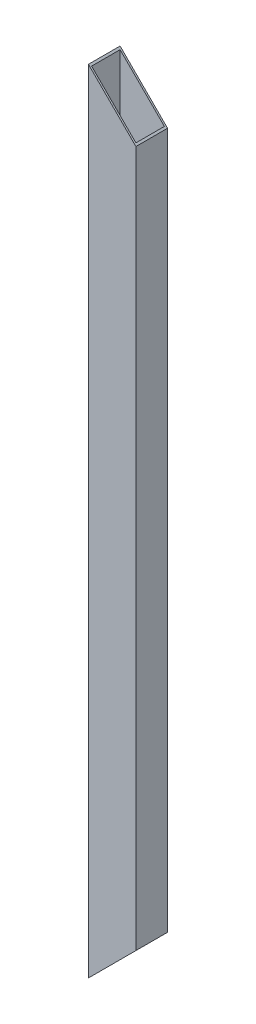
ISO-10303-21;
HEADER;
FILE_DESCRIPTION(('STEP AP214'),'2;1');
FILE_NAME('part.step','',(''),(''),'','','');
FILE_SCHEMA(('AUTOMOTIVE_DESIGN { 1 0 10303 214 1 1 1 1 }'));
ENDSEC;
DATA;
#1=APPLICATION_CONTEXT('core data for automotive mechanical design processes');
#2=APPLICATION_PROTOCOL_DEFINITION('international standard','automotive_design',2000,#1);
#3=PRODUCT_CONTEXT('',#1,'mechanical');
#4=PRODUCT('Part','Part','',(#3));
#5=PRODUCT_RELATED_PRODUCT_CATEGORY('part','',(#4));
#6=PRODUCT_DEFINITION_FORMATION('','',#4);
#7=PRODUCT_DEFINITION_CONTEXT('part definition',#1,'design');
#8=PRODUCT_DEFINITION('design','',#6,#7);
#9=PRODUCT_DEFINITION_SHAPE('','',#8);
#10=(LENGTH_UNIT() NAMED_UNIT(*) SI_UNIT(.MILLI.,.METRE.));
#11=(NAMED_UNIT(*) PLANE_ANGLE_UNIT() SI_UNIT($,.RADIAN.));
#12=(NAMED_UNIT(*) SI_UNIT($,.STERADIAN.) SOLID_ANGLE_UNIT());
#13=UNCERTAINTY_MEASURE_WITH_UNIT(LENGTH_MEASURE(1.E-05),#10,'distance_accuracy_value','');
#14=(GEOMETRIC_REPRESENTATION_CONTEXT(3) GLOBAL_UNCERTAINTY_ASSIGNED_CONTEXT((#13)) GLOBAL_UNIT_ASSIGNED_CONTEXT((#10,
#11,#12)) REPRESENTATION_CONTEXT('',''));
#15=CARTESIAN_POINT('',(0.,0.,0.));
#16=DIRECTION('',(0.,0.,1.));
#17=DIRECTION('',(1.,0.,0.));
#18=AXIS2_PLACEMENT_3D('',#15,#16,#17);
#19=CARTESIAN_POINT('',(2.,1000.,-38.));
#20=DIRECTION('',(0.,0.,1.));
#21=DIRECTION('',(1.,0.,0.));
#22=AXIS2_PLACEMENT_3D('',#19,#20,#21);
#23=PLANE('',#22);
#24=DIRECTION('',(0.,-1.,0.));
#25=VECTOR('',#24,1.);
#26=CARTESIAN_POINT('',(58.,1000.,-38.));
#27=LINE('',#26,#25);
#28=CARTESIAN_POINT('',(58.,942.,-38.));
#29=VERTEX_POINT('',#28);
#30=CARTESIAN_POINT('',(58.,58.0000000000007,-38.));
#31=VERTEX_POINT('',#30);
#32=EDGE_CURVE('E150',#29,#31,#27,.T.);
#33=ORIENTED_EDGE('',*,*,#32,.F.);
#34=DIRECTION('',(-0.707106781186546,0.707106781186549,0.));
#35=VECTOR('',#34,1.);
#36=CARTESIAN_POINT('',(1.,999.,-38.));
#37=LINE('',#36,#35);
#38=CARTESIAN_POINT('',(2.,998.,-38.));
#39=VERTEX_POINT('',#38);
#40=EDGE_CURVE('E11',#29,#39,#37,.T.);
#41=ORIENTED_EDGE('',*,*,#40,.T.);
#42=DIRECTION('',(0.,-1.,0.));
#43=VECTOR('',#42,1.);
#44=CARTESIAN_POINT('',(2.,1000.,-38.));
#45=LINE('',#44,#43);
#46=CARTESIAN_POINT('',(1.99999999999995,2.00000000000011,-38.));
#47=VERTEX_POINT('',#46);
#48=EDGE_CURVE('E145',#39,#47,#45,.T.);
#49=ORIENTED_EDGE('',*,*,#48,.T.);
#50=DIRECTION('',(-0.707106781186544,-0.707106781186551,0.));
#51=VECTOR('',#50,1.);
#52=CARTESIAN_POINT('',(501.,501.000000000005,-38.));
#53=LINE('',#52,#51);
#54=EDGE_CURVE('E41',#31,#47,#53,.T.);
#55=ORIENTED_EDGE('',*,*,#54,.F.);
#56=EDGE_LOOP('',(#33,#41,#49,#55));
#57=FACE_BOUND('',#56,.T.);
#58=ADVANCED_FACE('F33',(#57),#23,.T.);
#59=CARTESIAN_POINT('',(58.,1000.,-38.));
#60=DIRECTION('',(-1.,0.,0.));
#61=DIRECTION('',(0.,0.,1.));
#62=AXIS2_PLACEMENT_3D('',#59,#60,#61);
#63=PLANE('',#62);
#64=DIRECTION('',(0.,-1.,0.));
#65=VECTOR('',#64,1.);
#66=CARTESIAN_POINT('',(58.,1000.,-2.));
#67=LINE('',#66,#65);
#68=CARTESIAN_POINT('',(58.,942.,-2.));
#69=VERTEX_POINT('',#68);
#70=CARTESIAN_POINT('',(58.,58.0000000000007,-2.));
#71=VERTEX_POINT('',#70);
#72=EDGE_CURVE('E153',#69,#71,#67,.T.);
#73=ORIENTED_EDGE('',*,*,#72,.F.);
#74=DIRECTION('',(0.,0.,-1.));
#75=VECTOR('',#74,1.);
#76=CARTESIAN_POINT('',(58.,942.,-38.));
#77=LINE('',#76,#75);
#78=EDGE_CURVE('E166',#69,#29,#77,.T.);
#79=ORIENTED_EDGE('',*,*,#78,.T.);
#80=ORIENTED_EDGE('',*,*,#32,.T.);
#81=DIRECTION('',(0.,0.,-1.));
#82=VECTOR('',#81,1.);
#83=CARTESIAN_POINT('',(58.,58.0000000000007,-37.9999999999998));
#84=LINE('',#83,#82);
#85=EDGE_CURVE('E136',#71,#31,#84,.T.);
#86=ORIENTED_EDGE('',*,*,#85,.F.);
#87=EDGE_LOOP('',(#73,#79,#80,#86));
#88=FACE_BOUND('',#87,.T.);
#89=ADVANCED_FACE('F165',(#88),#63,.T.);
#90=CARTESIAN_POINT('',(2.,1000.,-2.));
#91=DIRECTION('',(0.,0.,-1.));
#92=DIRECTION('',(-1.,0.,0.));
#93=AXIS2_PLACEMENT_3D('',#90,#91,#92);
#94=PLANE('',#93);
#95=DIRECTION('',(0.,-1.,0.));
#96=VECTOR('',#95,1.);
#97=CARTESIAN_POINT('',(2.,1000.,-2.));
#98=LINE('',#97,#96);
#99=CARTESIAN_POINT('',(2.,998.,-2.));
#100=VERTEX_POINT('',#99);
#101=CARTESIAN_POINT('',(2.,2.00000000000006,-2.));
#102=VERTEX_POINT('',#101);
#103=EDGE_CURVE('E119',#100,#102,#98,.T.);
#104=ORIENTED_EDGE('',*,*,#103,.F.);
#105=DIRECTION('',(0.707106781186546,-0.707106781186549,0.));
#106=VECTOR('',#105,1.);
#107=CARTESIAN_POINT('',(1.00000000000001,999.,-2.));
#108=LINE('',#107,#106);
#109=EDGE_CURVE('E162',#100,#69,#108,.T.);
#110=ORIENTED_EDGE('',*,*,#109,.T.);
#111=ORIENTED_EDGE('',*,*,#72,.T.);
#112=DIRECTION('',(0.707106781186544,0.707106781186551,0.));
#113=VECTOR('',#112,1.);
#114=CARTESIAN_POINT('',(501.,501.000000000005,-2.));
#115=LINE('',#114,#113);
#116=EDGE_CURVE('E148',#102,#71,#115,.T.);
#117=ORIENTED_EDGE('',*,*,#116,.F.);
#118=EDGE_LOOP('',(#104,#110,#111,#117));
#119=FACE_BOUND('',#118,.T.);
#120=ADVANCED_FACE('F161',(#119),#94,.T.);
#121=CARTESIAN_POINT('',(2.,1000.,-38.));
#122=DIRECTION('',(1.,0.,0.));
#123=DIRECTION('',(0.,0.,-1.));
#124=AXIS2_PLACEMENT_3D('',#121,#122,#123);
#125=PLANE('',#124);
#126=ORIENTED_EDGE('',*,*,#48,.F.);
#127=DIRECTION('',(0.,0.,1.));
#128=VECTOR('',#127,1.);
#129=CARTESIAN_POINT('',(2.,998.,-38.));
#130=LINE('',#129,#128);
#131=EDGE_CURVE('E56',#39,#100,#130,.T.);
#132=ORIENTED_EDGE('',*,*,#131,.T.);
#133=ORIENTED_EDGE('',*,*,#103,.T.);
#134=DIRECTION('',(0.,0.,1.));
#135=VECTOR('',#134,1.);
#136=CARTESIAN_POINT('',(2.,2.00000000000011,-37.9999999999999));
#137=LINE('',#136,#135);
#138=EDGE_CURVE('E133',#47,#102,#137,.T.);
#139=ORIENTED_EDGE('',*,*,#138,.F.);
#140=EDGE_LOOP('',(#126,#132,#133,#139));
#141=FACE_BOUND('',#140,.T.);
#142=ADVANCED_FACE('F144',(#141),#125,.T.);
#143=CARTESIAN_POINT('',(0.,0.,660.));
#144=DIRECTION('',(-0.707106781186551,0.707106781186544,0.));
#145=DIRECTION('',(-0.707106781186544,-0.707106781186551,0.));
#146=AXIS2_PLACEMENT_3D('',#143,#144,#145);
#147=PLANE('',#146);
#148=ORIENTED_EDGE('',*,*,#138,.T.);
#149=ORIENTED_EDGE('',*,*,#116,.T.);
#150=ORIENTED_EDGE('',*,*,#85,.T.);
#151=ORIENTED_EDGE('',*,*,#54,.T.);
#152=EDGE_LOOP('',(#148,#149,#150,#151));
#153=FACE_BOUND('',#152,.T.);
#154=DIRECTION('',(0.,0.,1.));
#155=VECTOR('',#154,1.);
#156=CARTESIAN_POINT('',(0.,0.,0.));
#157=LINE('',#156,#155);
#158=CARTESIAN_POINT('',(0.,0.,-40.));
#159=VERTEX_POINT('',#158);
#160=CARTESIAN_POINT('',(0.,0.,0.));
#161=VERTEX_POINT('',#160);
#162=EDGE_CURVE('E117',#159,#161,#157,.T.);
#163=ORIENTED_EDGE('',*,*,#162,.F.);
#164=DIRECTION('',(0.707106781186544,0.707106781186551,0.));
#165=VECTOR('',#164,1.);
#166=CARTESIAN_POINT('',(0.,0.,-40.));
#167=LINE('',#166,#165);
#168=CARTESIAN_POINT('',(60.,60.0000000000006,-40.));
#169=VERTEX_POINT('',#168);
#170=EDGE_CURVE('E109',#159,#169,#167,.T.);
#171=ORIENTED_EDGE('',*,*,#170,.T.);
#172=DIRECTION('',(0.,0.,-1.));
#173=VECTOR('',#172,1.);
#174=CARTESIAN_POINT('',(60.,60.0000000000006,660.));
#175=LINE('',#174,#173);
#176=CARTESIAN_POINT('',(60.,60.0000000000006,0.));
#177=VERTEX_POINT('',#176);
#178=EDGE_CURVE('E103',#177,#169,#175,.T.);
#179=ORIENTED_EDGE('',*,*,#178,.F.);
#180=DIRECTION('',(0.707106781186544,0.707106781186551,0.));
#181=VECTOR('',#180,1.);
#182=CARTESIAN_POINT('',(500.,500.000000000005,0.));
#183=LINE('',#182,#181);
#184=EDGE_CURVE('E147',#161,#177,#183,.T.);
#185=ORIENTED_EDGE('',*,*,#184,.F.);
#186=EDGE_LOOP('',(#163,#171,#179,#185));
#187=FACE_BOUND('',#186,.T.);
#188=ADVANCED_FACE('F131',(#153,#187),#147,.F.);
#189=CARTESIAN_POINT('',(500.,499.999999999998,660.));
#190=DIRECTION('',(0.707106781186549,0.707106781186546,0.));
#191=DIRECTION('',(-0.707106781186546,0.707106781186549,0.));
#192=AXIS2_PLACEMENT_3D('',#189,#190,#191);
#193=PLANE('',#192);
#194=ORIENTED_EDGE('',*,*,#40,.F.);
#195=ORIENTED_EDGE('',*,*,#78,.F.);
#196=ORIENTED_EDGE('',*,*,#109,.F.);
#197=ORIENTED_EDGE('',*,*,#131,.F.);
#198=EDGE_LOOP('',(#194,#195,#196,#197));
#199=FACE_BOUND('',#198,.T.);
#200=DIRECTION('',(0.707106781186546,-0.707106781186549,0.));
#201=VECTOR('',#200,1.);
#202=CARTESIAN_POINT('',(0.,1000.,0.));
#203=LINE('',#202,#201);
#204=CARTESIAN_POINT('',(0.,1000.,0.));
#205=VERTEX_POINT('',#204);
#206=CARTESIAN_POINT('',(60.,940.,0.));
#207=VERTEX_POINT('',#206);
#208=EDGE_CURVE('E151',#205,#207,#203,.T.);
#209=ORIENTED_EDGE('',*,*,#208,.T.);
#210=DIRECTION('',(0.,0.,-1.));
#211=VECTOR('',#210,1.);
#212=CARTESIAN_POINT('',(60.,940.,660.));
#213=LINE('',#212,#211);
#214=CARTESIAN_POINT('',(60.,940.,-40.));
#215=VERTEX_POINT('',#214);
#216=EDGE_CURVE('E48',#207,#215,#213,.T.);
#217=ORIENTED_EDGE('',*,*,#216,.T.);
#218=DIRECTION('',(0.707106781186546,-0.707106781186549,0.));
#219=VECTOR('',#218,1.);
#220=CARTESIAN_POINT('',(500.,499.999999999998,-40.));
#221=LINE('',#220,#219);
#222=CARTESIAN_POINT('',(0.,1000.,-40.));
#223=VERTEX_POINT('',#222);
#224=EDGE_CURVE('E94',#223,#215,#221,.T.);
#225=ORIENTED_EDGE('',*,*,#224,.F.);
#226=DIRECTION('',(0.,0.,1.));
#227=VECTOR('',#226,1.);
#228=CARTESIAN_POINT('',(0.,1000.,0.));
#229=LINE('',#228,#227);
#230=EDGE_CURVE('E98',#223,#205,#229,.T.);
#231=ORIENTED_EDGE('',*,*,#230,.T.);
#232=EDGE_LOOP('',(#209,#217,#225,#231));
#233=FACE_BOUND('',#232,.T.);
#234=ADVANCED_FACE('F96',(#199,#233),#193,.T.);
#235=CARTESIAN_POINT('',(0.,1000.,0.));
#236=DIRECTION('',(0.,0.,-1.));
#237=DIRECTION('',(-1.,0.,0.));
#238=AXIS2_PLACEMENT_3D('',#235,#236,#237);
#239=PLANE('',#238);
#240=ORIENTED_EDGE('',*,*,#208,.F.);
#241=DIRECTION('',(0.,-1.,0.));
#242=VECTOR('',#241,1.);
#243=CARTESIAN_POINT('',(0.,1000.,0.));
#244=LINE('',#243,#242);
#245=EDGE_CURVE('E116',#205,#161,#244,.T.);
#246=ORIENTED_EDGE('',*,*,#245,.T.);
#247=ORIENTED_EDGE('',*,*,#184,.T.);
#248=DIRECTION('',(0.,-1.,0.));
#249=VECTOR('',#248,1.);
#250=CARTESIAN_POINT('',(60.,1000.,0.));
#251=LINE('',#250,#249);
#252=EDGE_CURVE('E125',#207,#177,#251,.T.);
#253=ORIENTED_EDGE('',*,*,#252,.F.);
#254=EDGE_LOOP('',(#240,#246,#247,#253));
#255=FACE_BOUND('',#254,.T.);
#256=ADVANCED_FACE('F178',(#255),#239,.F.);
#257=CARTESIAN_POINT('',(60.,1000.,0.));
#258=DIRECTION('',(-1.,0.,0.));
#259=DIRECTION('',(0.,0.,1.));
#260=AXIS2_PLACEMENT_3D('',#257,#258,#259);
#261=PLANE('',#260);
#262=ORIENTED_EDGE('',*,*,#216,.F.);
#263=ORIENTED_EDGE('',*,*,#252,.T.);
#264=ORIENTED_EDGE('',*,*,#178,.T.);
#265=DIRECTION('',(0.,-1.,0.));
#266=VECTOR('',#265,1.);
#267=CARTESIAN_POINT('',(60.,1000.,-40.));
#268=LINE('',#267,#266);
#269=EDGE_CURVE('E112',#215,#169,#268,.T.);
#270=ORIENTED_EDGE('',*,*,#269,.F.);
#271=EDGE_LOOP('',(#262,#263,#264,#270));
#272=FACE_BOUND('',#271,.T.);
#273=ADVANCED_FACE('F181',(#272),#261,.F.);
#274=CARTESIAN_POINT('',(0.,1000.,-40.));
#275=DIRECTION('',(0.,0.,1.));
#276=DIRECTION('',(1.,0.,0.));
#277=AXIS2_PLACEMENT_3D('',#274,#275,#276);
#278=PLANE('',#277);
#279=ORIENTED_EDGE('',*,*,#224,.T.);
#280=ORIENTED_EDGE('',*,*,#269,.T.);
#281=ORIENTED_EDGE('',*,*,#170,.F.);
#282=DIRECTION('',(0.,-1.,0.));
#283=VECTOR('',#282,1.);
#284=CARTESIAN_POINT('',(0.,1000.,-40.));
#285=LINE('',#284,#283);
#286=EDGE_CURVE('E107',#223,#159,#285,.T.);
#287=ORIENTED_EDGE('',*,*,#286,.F.);
#288=EDGE_LOOP('',(#279,#280,#281,#287));
#289=FACE_BOUND('',#288,.T.);
#290=ADVANCED_FACE('F108',(#289),#278,.F.);
#291=CARTESIAN_POINT('',(0.,1000.,0.));
#292=DIRECTION('',(1.,0.,0.));
#293=DIRECTION('',(0.,0.,-1.));
#294=AXIS2_PLACEMENT_3D('',#291,#292,#293);
#295=PLANE('',#294);
#296=ORIENTED_EDGE('',*,*,#162,.T.);
#297=ORIENTED_EDGE('',*,*,#245,.F.);
#298=ORIENTED_EDGE('',*,*,#230,.F.);
#299=ORIENTED_EDGE('',*,*,#286,.T.);
#300=EDGE_LOOP('',(#296,#297,#298,#299));
#301=FACE_BOUND('',#300,.T.);
#302=ADVANCED_FACE('F35',(#301),#295,.F.);
#303=CLOSED_SHELL('',(#58,#89,#120,#142,#188,#234,#256,#273,#290,#302));
#304=MANIFOLD_SOLID_BREP('B2',#303);
#305=ADVANCED_BREP_SHAPE_REPRESENTATION('',(#18,#304),#14);
#306=SHAPE_DEFINITION_REPRESENTATION(#9,#305);
ENDSEC;
END-ISO-10303-21;
